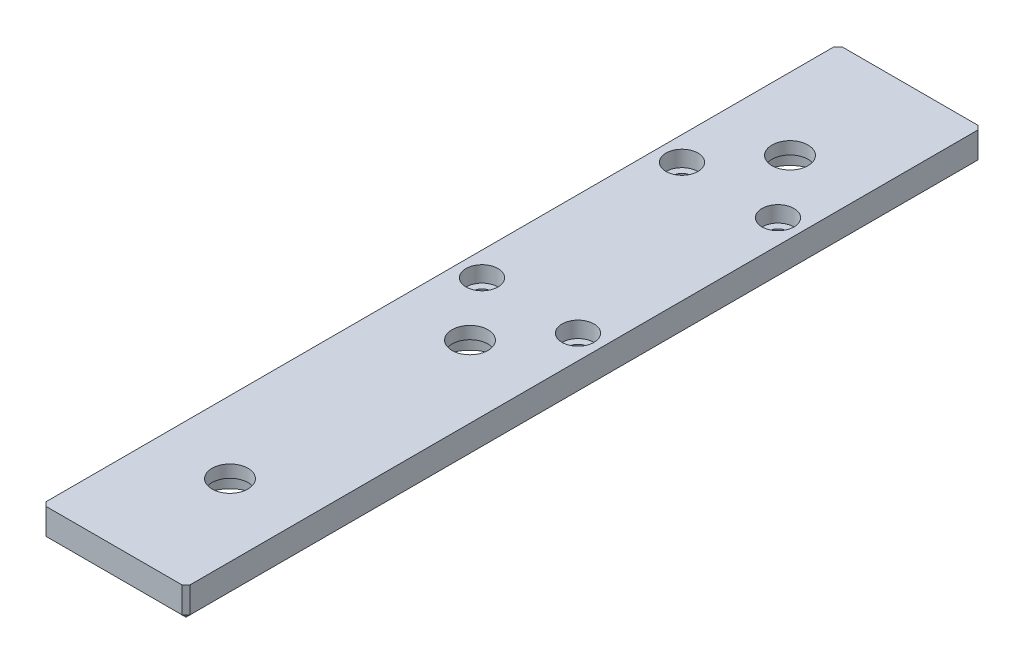
ISO-10303-21;
HEADER;
FILE_DESCRIPTION(('STEP AP214'),'2;1');
FILE_NAME('part.step','',(''),(''),'','','');
FILE_SCHEMA(('AUTOMOTIVE_DESIGN { 1 0 10303 214 1 1 1 1 }'));
ENDSEC;
DATA;
#1=APPLICATION_CONTEXT('core data for automotive mechanical design processes');
#2=APPLICATION_PROTOCOL_DEFINITION('international standard','automotive_design',2000,#1);
#3=PRODUCT_CONTEXT('',#1,'mechanical');
#4=PRODUCT('Part','Part','',(#3));
#5=PRODUCT_RELATED_PRODUCT_CATEGORY('part','',(#4));
#6=PRODUCT_DEFINITION_FORMATION('','',#4);
#7=PRODUCT_DEFINITION_CONTEXT('part definition',#1,'design');
#8=PRODUCT_DEFINITION('design','',#6,#7);
#9=PRODUCT_DEFINITION_SHAPE('','',#8);
#10=(LENGTH_UNIT() NAMED_UNIT(*) SI_UNIT(.MILLI.,.METRE.));
#11=(NAMED_UNIT(*) PLANE_ANGLE_UNIT() SI_UNIT($,.RADIAN.));
#12=(NAMED_UNIT(*) SI_UNIT($,.STERADIAN.) SOLID_ANGLE_UNIT());
#13=UNCERTAINTY_MEASURE_WITH_UNIT(LENGTH_MEASURE(1.E-05),#10,'distance_accuracy_value','');
#14=(GEOMETRIC_REPRESENTATION_CONTEXT(3) GLOBAL_UNCERTAINTY_ASSIGNED_CONTEXT((#13)) GLOBAL_UNIT_ASSIGNED_CONTEXT((#10,
#11,#12)) REPRESENTATION_CONTEXT('',''));
#15=CARTESIAN_POINT('',(0.,0.,0.));
#16=DIRECTION('',(0.,0.,1.));
#17=DIRECTION('',(1.,0.,0.));
#18=AXIS2_PLACEMENT_3D('',#15,#16,#17);
#19=CARTESIAN_POINT('',(18.,7.5,-99.5));
#20=DIRECTION('',(-1.,0.,0.));
#21=DIRECTION('',(0.,0.,1.));
#22=AXIS2_PLACEMENT_3D('',#19,#20,#21);
#23=PLANE('',#22);
#24=DIRECTION('',(0.,0.,-1.));
#25=VECTOR('',#24,1.);
#26=CARTESIAN_POINT('',(18.,1.,-99.5));
#27=LINE('',#26,#25);
#28=CARTESIAN_POINT('',(18.,1.,98.5));
#29=VERTEX_POINT('',#28);
#30=CARTESIAN_POINT('',(18.,1.,-98.5));
#31=VERTEX_POINT('',#30);
#32=EDGE_CURVE('E49',#29,#31,#27,.T.);
#33=ORIENTED_EDGE('',*,*,#32,.T.);
#34=DIRECTION('',(0.,1.,0.));
#35=VECTOR('',#34,1.);
#36=CARTESIAN_POINT('',(18.,7.5,-98.5));
#37=LINE('',#36,#35);
#38=CARTESIAN_POINT('',(18.,7.5,-98.5));
#39=VERTEX_POINT('',#38);
#40=EDGE_CURVE('E11',#31,#39,#37,.T.);
#41=ORIENTED_EDGE('',*,*,#40,.T.);
#42=DIRECTION('',(0.,0.,-1.));
#43=VECTOR('',#42,1.);
#44=CARTESIAN_POINT('',(18.,7.5,-99.5));
#45=LINE('',#44,#43);
#46=CARTESIAN_POINT('',(18.,7.5,98.5));
#47=VERTEX_POINT('',#46);
#48=EDGE_CURVE('E123',#47,#39,#45,.T.);
#49=ORIENTED_EDGE('',*,*,#48,.F.);
#50=DIRECTION('',(0.,-1.,0.));
#51=VECTOR('',#50,1.);
#52=CARTESIAN_POINT('',(18.,7.5,98.5));
#53=LINE('',#52,#51);
#54=EDGE_CURVE('E60',#47,#29,#53,.T.);
#55=ORIENTED_EDGE('',*,*,#54,.T.);
#56=EDGE_LOOP('',(#33,#41,#49,#55));
#57=FACE_BOUND('',#56,.T.);
#58=ADVANCED_FACE('F39',(#57),#23,.F.);
#59=CARTESIAN_POINT('',(-18.,7.5,-99.5));
#60=DIRECTION('',(0.,0.,1.));
#61=DIRECTION('',(1.,0.,0.));
#62=AXIS2_PLACEMENT_3D('',#59,#60,#61);
#63=PLANE('',#62);
#64=DIRECTION('',(-1.,0.,0.));
#65=VECTOR('',#64,1.);
#66=CARTESIAN_POINT('',(-18.,1.,-99.5));
#67=LINE('',#66,#65);
#68=CARTESIAN_POINT('',(17.,1.,-99.5));
#69=VERTEX_POINT('',#68);
#70=CARTESIAN_POINT('',(-17.,1.,-99.5));
#71=VERTEX_POINT('',#70);
#72=EDGE_CURVE('E142',#69,#71,#67,.T.);
#73=ORIENTED_EDGE('',*,*,#72,.T.);
#74=DIRECTION('',(0.,1.,0.));
#75=VECTOR('',#74,1.);
#76=CARTESIAN_POINT('',(-17.,7.5,-99.5));
#77=LINE('',#76,#75);
#78=CARTESIAN_POINT('',(-17.,7.5,-99.5));
#79=VERTEX_POINT('',#78);
#80=EDGE_CURVE('E135',#71,#79,#77,.T.);
#81=ORIENTED_EDGE('',*,*,#80,.T.);
#82=DIRECTION('',(-1.,0.,0.));
#83=VECTOR('',#82,1.);
#84=CARTESIAN_POINT('',(-18.,7.5,-99.5));
#85=LINE('',#84,#83);
#86=CARTESIAN_POINT('',(17.,7.5,-99.5));
#87=VERTEX_POINT('',#86);
#88=EDGE_CURVE('E121',#87,#79,#85,.T.);
#89=ORIENTED_EDGE('',*,*,#88,.F.);
#90=DIRECTION('',(0.,-1.,0.));
#91=VECTOR('',#90,1.);
#92=CARTESIAN_POINT('',(17.,7.5,-99.5));
#93=LINE('',#92,#91);
#94=EDGE_CURVE('E132',#87,#69,#93,.T.);
#95=ORIENTED_EDGE('',*,*,#94,.T.);
#96=EDGE_LOOP('',(#73,#81,#89,#95));
#97=FACE_BOUND('',#96,.T.);
#98=ADVANCED_FACE('F131',(#97),#63,.F.);
#99=CARTESIAN_POINT('',(-18.,7.5,-99.5));
#100=DIRECTION('',(1.,0.,0.));
#101=DIRECTION('',(0.,0.,-1.));
#102=AXIS2_PLACEMENT_3D('',#99,#100,#101);
#103=PLANE('',#102);
#104=DIRECTION('',(0.,0.,1.));
#105=VECTOR('',#104,1.);
#106=CARTESIAN_POINT('',(-18.,7.5,-99.5));
#107=LINE('',#106,#105);
#108=CARTESIAN_POINT('',(-18.,7.5,-98.5));
#109=VERTEX_POINT('',#108);
#110=CARTESIAN_POINT('',(-18.,7.5,98.5));
#111=VERTEX_POINT('',#110);
#112=EDGE_CURVE('E136',#109,#111,#107,.T.);
#113=ORIENTED_EDGE('',*,*,#112,.F.);
#114=DIRECTION('',(0.,-1.,0.));
#115=VECTOR('',#114,1.);
#116=CARTESIAN_POINT('',(-18.,7.5,-98.5));
#117=LINE('',#116,#115);
#118=CARTESIAN_POINT('',(-18.,1.,-98.5));
#119=VERTEX_POINT('',#118);
#120=EDGE_CURVE('E164',#109,#119,#117,.T.);
#121=ORIENTED_EDGE('',*,*,#120,.T.);
#122=DIRECTION('',(0.,0.,1.));
#123=VECTOR('',#122,1.);
#124=CARTESIAN_POINT('',(-18.,1.,-99.5));
#125=LINE('',#124,#123);
#126=CARTESIAN_POINT('',(-18.,1.,98.5));
#127=VERTEX_POINT('',#126);
#128=EDGE_CURVE('E162',#119,#127,#125,.T.);
#129=ORIENTED_EDGE('',*,*,#128,.T.);
#130=DIRECTION('',(0.,1.,0.));
#131=VECTOR('',#130,1.);
#132=CARTESIAN_POINT('',(-18.,7.5,98.5));
#133=LINE('',#132,#131);
#134=EDGE_CURVE('E160',#127,#111,#133,.T.);
#135=ORIENTED_EDGE('',*,*,#134,.T.);
#136=EDGE_LOOP('',(#113,#121,#129,#135));
#137=FACE_BOUND('',#136,.T.);
#138=ADVANCED_FACE('F310',(#137),#103,.F.);
#139=CARTESIAN_POINT('',(-18.,7.5,99.5));
#140=DIRECTION('',(0.,0.,-1.));
#141=DIRECTION('',(-1.,0.,0.));
#142=AXIS2_PLACEMENT_3D('',#139,#140,#141);
#143=PLANE('',#142);
#144=DIRECTION('',(1.,0.,0.));
#145=VECTOR('',#144,1.);
#146=CARTESIAN_POINT('',(-18.,7.5,99.5));
#147=LINE('',#146,#145);
#148=CARTESIAN_POINT('',(-17.,7.5,99.5));
#149=VERTEX_POINT('',#148);
#150=CARTESIAN_POINT('',(17.,7.5,99.5));
#151=VERTEX_POINT('',#150);
#152=EDGE_CURVE('E143',#149,#151,#147,.T.);
#153=ORIENTED_EDGE('',*,*,#152,.F.);
#154=DIRECTION('',(0.,-1.,0.));
#155=VECTOR('',#154,1.);
#156=CARTESIAN_POINT('',(-17.,7.5,99.5));
#157=LINE('',#156,#155);
#158=CARTESIAN_POINT('',(-17.,1.,99.5));
#159=VERTEX_POINT('',#158);
#160=EDGE_CURVE('E174',#149,#159,#157,.T.);
#161=ORIENTED_EDGE('',*,*,#160,.T.);
#162=DIRECTION('',(1.,0.,0.));
#163=VECTOR('',#162,1.);
#164=CARTESIAN_POINT('',(-18.,1.,99.5));
#165=LINE('',#164,#163);
#166=CARTESIAN_POINT('',(17.,1.,99.5));
#167=VERTEX_POINT('',#166);
#168=EDGE_CURVE('E172',#159,#167,#165,.T.);
#169=ORIENTED_EDGE('',*,*,#168,.T.);
#170=DIRECTION('',(0.,1.,0.));
#171=VECTOR('',#170,1.);
#172=CARTESIAN_POINT('',(17.,7.5,99.5));
#173=LINE('',#172,#171);
#174=EDGE_CURVE('E170',#167,#151,#173,.T.);
#175=ORIENTED_EDGE('',*,*,#174,.T.);
#176=EDGE_LOOP('',(#153,#161,#169,#175));
#177=FACE_BOUND('',#176,.T.);
#178=ADVANCED_FACE('F276',(#177),#143,.F.);
#179=CARTESIAN_POINT('',(0.,7.5,0.));
#180=DIRECTION('',(0.,1.,0.));
#181=DIRECTION('',(0.,0.,1.));
#182=AXIS2_PLACEMENT_3D('',#179,#180,#181);
#183=PLANE('',#182);
#184=CARTESIAN_POINT('',(0.,7.5,-69.5));
#185=DIRECTION('',(0.,-1.,0.));
#186=DIRECTION('',(0.,0.,-1.));
#187=AXIS2_PLACEMENT_3D('',#184,#185,#186);
#188=CIRCLE('',#187,4.5);
#189=CARTESIAN_POINT('',(0.,7.5,-74.));
#190=VERTEX_POINT('',#189);
#191=EDGE_CURVE('E711',#190,#190,#188,.T.);
#192=ORIENTED_EDGE('',*,*,#191,.T.);
#193=EDGE_LOOP('',(#192));
#194=FACE_BOUND('',#193,.T.);
#195=CARTESIAN_POINT('',(0.,7.5,10.5));
#196=DIRECTION('',(0.,-1.,0.));
#197=DIRECTION('',(0.,0.,-1.));
#198=AXIS2_PLACEMENT_3D('',#195,#196,#197);
#199=CIRCLE('',#198,4.5);
#200=CARTESIAN_POINT('',(0.,7.5,6.00000000000002));
#201=VERTEX_POINT('',#200);
#202=EDGE_CURVE('E723',#201,#201,#199,.T.);
#203=ORIENTED_EDGE('',*,*,#202,.T.);
#204=EDGE_LOOP('',(#203));
#205=FACE_BOUND('',#204,.T.);
#206=CARTESIAN_POINT('',(0.,7.5,70.5));
#207=DIRECTION('',(0.,-1.,0.));
#208=DIRECTION('',(0.,0.,-1.));
#209=AXIS2_PLACEMENT_3D('',#206,#207,#208);
#210=CIRCLE('',#209,4.5);
#211=CARTESIAN_POINT('',(0.,7.5,66.));
#212=VERTEX_POINT('',#211);
#213=EDGE_CURVE('E181',#212,#212,#210,.T.);
#214=ORIENTED_EDGE('',*,*,#213,.T.);
#215=EDGE_LOOP('',(#214));
#216=FACE_BOUND('',#215,.T.);
#217=CARTESIAN_POINT('',(-12.,7.5,-54.5));
#218=DIRECTION('',(0.,1.,0.));
#219=DIRECTION('',(0.,0.,1.));
#220=AXIS2_PLACEMENT_3D('',#217,#218,#219);
#221=CIRCLE('',#220,4.);
#222=CARTESIAN_POINT('',(-12.,7.5,-50.5));
#223=VERTEX_POINT('',#222);
#224=EDGE_CURVE('E209',#223,#223,#221,.T.);
#225=ORIENTED_EDGE('',*,*,#224,.F.);
#226=EDGE_LOOP('',(#225));
#227=FACE_BOUND('',#226,.T.);
#228=CARTESIAN_POINT('',(12.,7.5,-54.5));
#229=DIRECTION('',(0.,1.,0.));
#230=DIRECTION('',(0.,0.,1.));
#231=AXIS2_PLACEMENT_3D('',#228,#229,#230);
#232=CIRCLE('',#231,4.);
#233=CARTESIAN_POINT('',(12.,7.5,-50.5));
#234=VERTEX_POINT('',#233);
#235=EDGE_CURVE('E227',#234,#234,#232,.T.);
#236=ORIENTED_EDGE('',*,*,#235,.F.);
#237=EDGE_LOOP('',(#236));
#238=FACE_BOUND('',#237,.T.);
#239=CARTESIAN_POINT('',(12.,7.5,-4.49999999999998));
#240=DIRECTION('',(0.,1.,0.));
#241=DIRECTION('',(0.,0.,1.));
#242=AXIS2_PLACEMENT_3D('',#239,#240,#241);
#243=CIRCLE('',#242,4.);
#244=CARTESIAN_POINT('',(12.,7.5,-0.499999999999983));
#245=VERTEX_POINT('',#244);
#246=EDGE_CURVE('E239',#245,#245,#243,.T.);
#247=ORIENTED_EDGE('',*,*,#246,.F.);
#248=EDGE_LOOP('',(#247));
#249=FACE_BOUND('',#248,.T.);
#250=CARTESIAN_POINT('',(-12.,7.5,-4.49999999999998));
#251=DIRECTION('',(0.,1.,0.));
#252=DIRECTION('',(0.,0.,1.));
#253=AXIS2_PLACEMENT_3D('',#250,#251,#252);
#254=CIRCLE('',#253,4.);
#255=CARTESIAN_POINT('',(-12.,7.5,-0.499999999999983));
#256=VERTEX_POINT('',#255);
#257=EDGE_CURVE('E251',#256,#256,#254,.T.);
#258=ORIENTED_EDGE('',*,*,#257,.F.);
#259=EDGE_LOOP('',(#258));
#260=FACE_BOUND('',#259,.T.);
#261=ORIENTED_EDGE('',*,*,#88,.T.);
#262=DIRECTION('',(0.707106781186548,0.,-0.707106781186548));
#263=VECTOR('',#262,1.);
#264=CARTESIAN_POINT('',(-58.25,7.5,-58.25));
#265=LINE('',#264,#263);
#266=EDGE_CURVE('E168',#79,#109,#265,.F.);
#267=ORIENTED_EDGE('',*,*,#266,.T.);
#268=ORIENTED_EDGE('',*,*,#112,.T.);
#269=DIRECTION('',(-0.707106781186548,0.,-0.707106781186548));
#270=VECTOR('',#269,1.);
#271=CARTESIAN_POINT('',(-58.25,7.5,58.25));
#272=LINE('',#271,#270);
#273=EDGE_CURVE('E126',#111,#149,#272,.F.);
#274=ORIENTED_EDGE('',*,*,#273,.T.);
#275=ORIENTED_EDGE('',*,*,#152,.T.);
#276=DIRECTION('',(-0.707106781186546,0.,0.707106781186549));
#277=VECTOR('',#276,1.);
#278=CARTESIAN_POINT('',(58.2500000000001,7.5,58.2499999999998));
#279=LINE('',#278,#277);
#280=EDGE_CURVE('E127',#151,#47,#279,.F.);
#281=ORIENTED_EDGE('',*,*,#280,.T.);
#282=ORIENTED_EDGE('',*,*,#48,.T.);
#283=DIRECTION('',(0.707106781186548,0.,0.707106781186548));
#284=VECTOR('',#283,1.);
#285=CARTESIAN_POINT('',(58.25,7.5,-58.25));
#286=LINE('',#285,#284);
#287=EDGE_CURVE('E118',#39,#87,#286,.F.);
#288=ORIENTED_EDGE('',*,*,#287,.T.);
#289=EDGE_LOOP('',(#261,#267,#268,#274,#275,#281,#282,#288));
#290=FACE_BOUND('',#289,.T.);
#291=ADVANCED_FACE('F120',(#194,#205,#216,#227,#238,#249,#260,#290),#183,.T.);
#292=CARTESIAN_POINT('',(0.,0.,0.));
#293=DIRECTION('',(0.,1.,0.));
#294=DIRECTION('',(0.,0.,1.));
#295=AXIS2_PLACEMENT_3D('',#292,#293,#294);
#296=PLANE('',#295);
#297=CARTESIAN_POINT('',(0.,0.,-69.5));
#298=DIRECTION('',(0.,-1.,0.));
#299=DIRECTION('',(0.,0.,-1.));
#300=AXIS2_PLACEMENT_3D('',#297,#298,#299);
#301=CIRCLE('',#300,7.5);
#302=CARTESIAN_POINT('',(0.,0.,-77.));
#303=VERTEX_POINT('',#302);
#304=EDGE_CURVE('E704',#303,#303,#301,.T.);
#305=ORIENTED_EDGE('',*,*,#304,.F.);
#306=EDGE_LOOP('',(#305));
#307=FACE_BOUND('',#306,.T.);
#308=CARTESIAN_POINT('',(0.,0.,10.5));
#309=DIRECTION('',(0.,-1.,0.));
#310=DIRECTION('',(0.,0.,-1.));
#311=AXIS2_PLACEMENT_3D('',#308,#309,#310);
#312=CIRCLE('',#311,7.5);
#313=CARTESIAN_POINT('',(0.,0.,3.00000000000001));
#314=VERTEX_POINT('',#313);
#315=EDGE_CURVE('E714',#314,#314,#312,.T.);
#316=ORIENTED_EDGE('',*,*,#315,.F.);
#317=EDGE_LOOP('',(#316));
#318=FACE_BOUND('',#317,.T.);
#319=CARTESIAN_POINT('',(0.,0.,70.5));
#320=DIRECTION('',(0.,-1.,0.));
#321=DIRECTION('',(0.,0.,-1.));
#322=AXIS2_PLACEMENT_3D('',#319,#320,#321);
#323=CIRCLE('',#322,7.5);
#324=CARTESIAN_POINT('',(0.,0.,63.));
#325=VERTEX_POINT('',#324);
#326=EDGE_CURVE('E726',#325,#325,#323,.T.);
#327=ORIENTED_EDGE('',*,*,#326,.F.);
#328=EDGE_LOOP('',(#327));
#329=FACE_BOUND('',#328,.T.);
#330=DIRECTION('',(0.,0.,-1.));
#331=VECTOR('',#330,1.);
#332=CARTESIAN_POINT('',(-17.,0.,0.));
#333=LINE('',#332,#331);
#334=CARTESIAN_POINT('',(-17.,0.,98.5));
#335=VERTEX_POINT('',#334);
#336=CARTESIAN_POINT('',(-17.,0.,-98.5));
#337=VERTEX_POINT('',#336);
#338=EDGE_CURVE('E155',#335,#337,#333,.T.);
#339=ORIENTED_EDGE('',*,*,#338,.T.);
#340=DIRECTION('',(1.,0.,0.));
#341=VECTOR('',#340,1.);
#342=CARTESIAN_POINT('',(0.,0.,-98.5));
#343=LINE('',#342,#341);
#344=CARTESIAN_POINT('',(17.,0.,-98.5));
#345=VERTEX_POINT('',#344);
#346=EDGE_CURVE('E157',#337,#345,#343,.T.);
#347=ORIENTED_EDGE('',*,*,#346,.T.);
#348=DIRECTION('',(0.,0.,1.));
#349=VECTOR('',#348,1.);
#350=CARTESIAN_POINT('',(17.,0.,0.));
#351=LINE('',#350,#349);
#352=CARTESIAN_POINT('',(17.,0.,98.5));
#353=VERTEX_POINT('',#352);
#354=EDGE_CURVE('E151',#345,#353,#351,.T.);
#355=ORIENTED_EDGE('',*,*,#354,.T.);
#356=DIRECTION('',(-1.,0.,0.));
#357=VECTOR('',#356,1.);
#358=CARTESIAN_POINT('',(0.,0.,98.5));
#359=LINE('',#358,#357);
#360=EDGE_CURVE('E153',#353,#335,#359,.T.);
#361=ORIENTED_EDGE('',*,*,#360,.T.);
#362=EDGE_LOOP('',(#339,#347,#355,#361));
#363=FACE_BOUND('',#362,.T.);
#364=CARTESIAN_POINT('',(-12.,0.,-54.5));
#365=DIRECTION('',(0.,1.,0.));
#366=DIRECTION('',(0.,0.,1.));
#367=AXIS2_PLACEMENT_3D('',#364,#365,#366);
#368=CIRCLE('',#367,2.25);
#369=CARTESIAN_POINT('',(-12.,0.,-52.25));
#370=VERTEX_POINT('',#369);
#371=EDGE_CURVE('E224',#370,#370,#368,.T.);
#372=ORIENTED_EDGE('',*,*,#371,.T.);
#373=EDGE_LOOP('',(#372));
#374=FACE_BOUND('',#373,.T.);
#375=CARTESIAN_POINT('',(12.,0.,-54.5));
#376=DIRECTION('',(0.,1.,0.));
#377=DIRECTION('',(0.,0.,1.));
#378=AXIS2_PLACEMENT_3D('',#375,#376,#377);
#379=CIRCLE('',#378,2.25);
#380=CARTESIAN_POINT('',(12.,0.,-52.25));
#381=VERTEX_POINT('',#380);
#382=EDGE_CURVE('E236',#381,#381,#379,.T.);
#383=ORIENTED_EDGE('',*,*,#382,.T.);
#384=EDGE_LOOP('',(#383));
#385=FACE_BOUND('',#384,.T.);
#386=CARTESIAN_POINT('',(12.,0.,-4.49999999999998));
#387=DIRECTION('',(0.,1.,0.));
#388=DIRECTION('',(0.,0.,1.));
#389=AXIS2_PLACEMENT_3D('',#386,#387,#388);
#390=CIRCLE('',#389,2.25);
#391=CARTESIAN_POINT('',(12.,0.,-2.24999999999998));
#392=VERTEX_POINT('',#391);
#393=EDGE_CURVE('E248',#392,#392,#390,.T.);
#394=ORIENTED_EDGE('',*,*,#393,.T.);
#395=EDGE_LOOP('',(#394));
#396=FACE_BOUND('',#395,.T.);
#397=CARTESIAN_POINT('',(-12.,0.,-4.49999999999998));
#398=DIRECTION('',(0.,1.,0.));
#399=DIRECTION('',(0.,0.,1.));
#400=AXIS2_PLACEMENT_3D('',#397,#398,#399);
#401=CIRCLE('',#400,2.25);
#402=CARTESIAN_POINT('',(-12.,0.,-2.24999999999998));
#403=VERTEX_POINT('',#402);
#404=EDGE_CURVE('E260',#403,#403,#401,.T.);
#405=ORIENTED_EDGE('',*,*,#404,.T.);
#406=EDGE_LOOP('',(#405));
#407=FACE_BOUND('',#406,.T.);
#408=ADVANCED_FACE('F284',(#307,#318,#329,#363,#374,#385,#396,#407),#296,.F.);
#409=CARTESIAN_POINT('',(-12.,7.5,-4.49999999999998));
#410=DIRECTION('',(0.,1.,0.));
#411=DIRECTION('',(0.,0.,1.));
#412=AXIS2_PLACEMENT_3D('',#409,#410,#411);
#413=CYLINDRICAL_SURFACE('',#412,2.25);
#414=ORIENTED_EDGE('',*,*,#404,.F.);
#415=EDGE_LOOP('',(#414));
#416=FACE_BOUND('',#415,.T.);
#417=CARTESIAN_POINT('',(-12.,3.5,-4.49999999999998));
#418=DIRECTION('',(0.,1.,0.));
#419=DIRECTION('',(0.,0.,1.));
#420=AXIS2_PLACEMENT_3D('',#417,#418,#419);
#421=CIRCLE('',#420,2.25);
#422=CARTESIAN_POINT('',(-12.,3.5,-2.24999999999998));
#423=VERTEX_POINT('',#422);
#424=EDGE_CURVE('E257',#423,#423,#421,.T.);
#425=ORIENTED_EDGE('',*,*,#424,.T.);
#426=EDGE_LOOP('',(#425));
#427=FACE_BOUND('',#426,.T.);
#428=ADVANCED_FACE('F429',(#416,#427),#413,.F.);
#429=CARTESIAN_POINT('',(-9.75,3.5,-4.49999999999998));
#430=DIRECTION('',(0.,-1.,0.));
#431=DIRECTION('',(0.,0.,-1.));
#432=AXIS2_PLACEMENT_3D('',#429,#430,#431);
#433=PLANE('',#432);
#434=ORIENTED_EDGE('',*,*,#424,.F.);
#435=EDGE_LOOP('',(#434));
#436=FACE_BOUND('',#435,.T.);
#437=CARTESIAN_POINT('',(-12.,3.5,-4.49999999999998));
#438=DIRECTION('',(0.,1.,0.));
#439=DIRECTION('',(0.,0.,1.));
#440=AXIS2_PLACEMENT_3D('',#437,#438,#439);
#441=CIRCLE('',#440,4.);
#442=CARTESIAN_POINT('',(-12.,3.5,-0.499999999999983));
#443=VERTEX_POINT('',#442);
#444=EDGE_CURVE('E254',#443,#443,#441,.T.);
#445=ORIENTED_EDGE('',*,*,#444,.T.);
#446=EDGE_LOOP('',(#445));
#447=FACE_BOUND('',#446,.T.);
#448=ADVANCED_FACE('F425',(#436,#447),#433,.F.);
#449=CARTESIAN_POINT('',(-12.,7.5,-4.49999999999998));
#450=DIRECTION('',(0.,1.,0.));
#451=DIRECTION('',(0.,0.,1.));
#452=AXIS2_PLACEMENT_3D('',#449,#450,#451);
#453=CYLINDRICAL_SURFACE('',#452,4.);
#454=ORIENTED_EDGE('',*,*,#444,.F.);
#455=EDGE_LOOP('',(#454));
#456=FACE_BOUND('',#455,.T.);
#457=ORIENTED_EDGE('',*,*,#257,.T.);
#458=EDGE_LOOP('',(#457));
#459=FACE_BOUND('',#458,.T.);
#460=ADVANCED_FACE('F421',(#456,#459),#453,.F.);
#461=CARTESIAN_POINT('',(12.,7.5,-4.49999999999998));
#462=DIRECTION('',(0.,1.,0.));
#463=DIRECTION('',(0.,0.,1.));
#464=AXIS2_PLACEMENT_3D('',#461,#462,#463);
#465=CYLINDRICAL_SURFACE('',#464,2.25);
#466=ORIENTED_EDGE('',*,*,#393,.F.);
#467=EDGE_LOOP('',(#466));
#468=FACE_BOUND('',#467,.T.);
#469=CARTESIAN_POINT('',(12.,3.5,-4.49999999999998));
#470=DIRECTION('',(0.,1.,0.));
#471=DIRECTION('',(0.,0.,1.));
#472=AXIS2_PLACEMENT_3D('',#469,#470,#471);
#473=CIRCLE('',#472,2.25);
#474=CARTESIAN_POINT('',(12.,3.5,-2.24999999999998));
#475=VERTEX_POINT('',#474);
#476=EDGE_CURVE('E245',#475,#475,#473,.T.);
#477=ORIENTED_EDGE('',*,*,#476,.T.);
#478=EDGE_LOOP('',(#477));
#479=FACE_BOUND('',#478,.T.);
#480=ADVANCED_FACE('F417',(#468,#479),#465,.F.);
#481=CARTESIAN_POINT('',(14.25,3.5,-4.49999999999998));
#482=DIRECTION('',(0.,-1.,0.));
#483=DIRECTION('',(0.,0.,-1.));
#484=AXIS2_PLACEMENT_3D('',#481,#482,#483);
#485=PLANE('',#484);
#486=ORIENTED_EDGE('',*,*,#476,.F.);
#487=EDGE_LOOP('',(#486));
#488=FACE_BOUND('',#487,.T.);
#489=CARTESIAN_POINT('',(12.,3.5,-4.49999999999998));
#490=DIRECTION('',(0.,1.,0.));
#491=DIRECTION('',(0.,0.,1.));
#492=AXIS2_PLACEMENT_3D('',#489,#490,#491);
#493=CIRCLE('',#492,4.);
#494=CARTESIAN_POINT('',(12.,3.5,-0.499999999999983));
#495=VERTEX_POINT('',#494);
#496=EDGE_CURVE('E242',#495,#495,#493,.T.);
#497=ORIENTED_EDGE('',*,*,#496,.T.);
#498=EDGE_LOOP('',(#497));
#499=FACE_BOUND('',#498,.T.);
#500=ADVANCED_FACE('F413',(#488,#499),#485,.F.);
#501=CARTESIAN_POINT('',(12.,7.5,-4.49999999999998));
#502=DIRECTION('',(0.,1.,0.));
#503=DIRECTION('',(0.,0.,1.));
#504=AXIS2_PLACEMENT_3D('',#501,#502,#503);
#505=CYLINDRICAL_SURFACE('',#504,4.);
#506=ORIENTED_EDGE('',*,*,#496,.F.);
#507=EDGE_LOOP('',(#506));
#508=FACE_BOUND('',#507,.T.);
#509=ORIENTED_EDGE('',*,*,#246,.T.);
#510=EDGE_LOOP('',(#509));
#511=FACE_BOUND('',#510,.T.);
#512=ADVANCED_FACE('F409',(#508,#511),#505,.F.);
#513=CARTESIAN_POINT('',(12.,7.5,-54.5));
#514=DIRECTION('',(0.,1.,0.));
#515=DIRECTION('',(0.,0.,1.));
#516=AXIS2_PLACEMENT_3D('',#513,#514,#515);
#517=CYLINDRICAL_SURFACE('',#516,2.25);
#518=ORIENTED_EDGE('',*,*,#382,.F.);
#519=EDGE_LOOP('',(#518));
#520=FACE_BOUND('',#519,.T.);
#521=CARTESIAN_POINT('',(12.,3.5,-54.5));
#522=DIRECTION('',(0.,1.,0.));
#523=DIRECTION('',(0.,0.,1.));
#524=AXIS2_PLACEMENT_3D('',#521,#522,#523);
#525=CIRCLE('',#524,2.25);
#526=CARTESIAN_POINT('',(12.,3.5,-52.25));
#527=VERTEX_POINT('',#526);
#528=EDGE_CURVE('E233',#527,#527,#525,.T.);
#529=ORIENTED_EDGE('',*,*,#528,.T.);
#530=EDGE_LOOP('',(#529));
#531=FACE_BOUND('',#530,.T.);
#532=ADVANCED_FACE('F405',(#520,#531),#517,.F.);
#533=CARTESIAN_POINT('',(14.25,3.5,-54.5));
#534=DIRECTION('',(0.,-1.,0.));
#535=DIRECTION('',(0.,0.,-1.));
#536=AXIS2_PLACEMENT_3D('',#533,#534,#535);
#537=PLANE('',#536);
#538=ORIENTED_EDGE('',*,*,#528,.F.);
#539=EDGE_LOOP('',(#538));
#540=FACE_BOUND('',#539,.T.);
#541=CARTESIAN_POINT('',(12.,3.5,-54.5));
#542=DIRECTION('',(0.,1.,0.));
#543=DIRECTION('',(0.,0.,1.));
#544=AXIS2_PLACEMENT_3D('',#541,#542,#543);
#545=CIRCLE('',#544,4.);
#546=CARTESIAN_POINT('',(12.,3.5,-50.5));
#547=VERTEX_POINT('',#546);
#548=EDGE_CURVE('E230',#547,#547,#545,.T.);
#549=ORIENTED_EDGE('',*,*,#548,.T.);
#550=EDGE_LOOP('',(#549));
#551=FACE_BOUND('',#550,.T.);
#552=ADVANCED_FACE('F401',(#540,#551),#537,.F.);
#553=CARTESIAN_POINT('',(12.,7.5,-54.5));
#554=DIRECTION('',(0.,1.,0.));
#555=DIRECTION('',(0.,0.,1.));
#556=AXIS2_PLACEMENT_3D('',#553,#554,#555);
#557=CYLINDRICAL_SURFACE('',#556,4.);
#558=ORIENTED_EDGE('',*,*,#548,.F.);
#559=EDGE_LOOP('',(#558));
#560=FACE_BOUND('',#559,.T.);
#561=ORIENTED_EDGE('',*,*,#235,.T.);
#562=EDGE_LOOP('',(#561));
#563=FACE_BOUND('',#562,.T.);
#564=ADVANCED_FACE('F397',(#560,#563),#557,.F.);
#565=CARTESIAN_POINT('',(-12.,7.5,-54.5));
#566=DIRECTION('',(0.,1.,0.));
#567=DIRECTION('',(0.,0.,1.));
#568=AXIS2_PLACEMENT_3D('',#565,#566,#567);
#569=CYLINDRICAL_SURFACE('',#568,2.25);
#570=ORIENTED_EDGE('',*,*,#371,.F.);
#571=EDGE_LOOP('',(#570));
#572=FACE_BOUND('',#571,.T.);
#573=CARTESIAN_POINT('',(-12.,3.5,-54.5));
#574=DIRECTION('',(0.,1.,0.));
#575=DIRECTION('',(0.,0.,1.));
#576=AXIS2_PLACEMENT_3D('',#573,#574,#575);
#577=CIRCLE('',#576,2.25);
#578=CARTESIAN_POINT('',(-12.,3.5,-52.25));
#579=VERTEX_POINT('',#578);
#580=EDGE_CURVE('E217',#579,#579,#577,.T.);
#581=ORIENTED_EDGE('',*,*,#580,.T.);
#582=EDGE_LOOP('',(#581));
#583=FACE_BOUND('',#582,.T.);
#584=ADVANCED_FACE('F388',(#572,#583),#569,.F.);
#585=CARTESIAN_POINT('',(-9.75,3.5,-54.5));
#586=DIRECTION('',(0.,-1.,0.));
#587=DIRECTION('',(0.,0.,-1.));
#588=AXIS2_PLACEMENT_3D('',#585,#586,#587);
#589=PLANE('',#588);
#590=ORIENTED_EDGE('',*,*,#580,.F.);
#591=EDGE_LOOP('',(#590));
#592=FACE_BOUND('',#591,.T.);
#593=CARTESIAN_POINT('',(-12.,3.5,-54.5));
#594=DIRECTION('',(0.,1.,0.));
#595=DIRECTION('',(0.,0.,1.));
#596=AXIS2_PLACEMENT_3D('',#593,#594,#595);
#597=CIRCLE('',#596,4.);
#598=CARTESIAN_POINT('',(-12.,3.5,-50.5));
#599=VERTEX_POINT('',#598);
#600=EDGE_CURVE('E212',#599,#599,#597,.T.);
#601=ORIENTED_EDGE('',*,*,#600,.T.);
#602=EDGE_LOOP('',(#601));
#603=FACE_BOUND('',#602,.T.);
#604=ADVANCED_FACE('F381',(#592,#603),#589,.F.);
#605=CARTESIAN_POINT('',(-12.,7.5,-54.5));
#606=DIRECTION('',(0.,1.,0.));
#607=DIRECTION('',(0.,0.,1.));
#608=AXIS2_PLACEMENT_3D('',#605,#606,#607);
#609=CYLINDRICAL_SURFACE('',#608,4.);
#610=ORIENTED_EDGE('',*,*,#600,.F.);
#611=EDGE_LOOP('',(#610));
#612=FACE_BOUND('',#611,.T.);
#613=ORIENTED_EDGE('',*,*,#224,.T.);
#614=EDGE_LOOP('',(#613));
#615=FACE_BOUND('',#614,.T.);
#616=ADVANCED_FACE('F376',(#612,#615),#609,.F.);
#617=CARTESIAN_POINT('',(18.,7.5,98.5));
#618=DIRECTION('',(-0.707106781186549,0.,-0.707106781186546));
#619=DIRECTION('',(0.,-1.,0.));
#620=AXIS2_PLACEMENT_3D('',#617,#618,#619);
#621=PLANE('',#620);
#622=ORIENTED_EDGE('',*,*,#280,.F.);
#623=ORIENTED_EDGE('',*,*,#174,.F.);
#624=DIRECTION('',(0.707106781186546,0.,-0.707106781186549));
#625=VECTOR('',#624,1.);
#626=CARTESIAN_POINT('',(17.,1.,99.5));
#627=LINE('',#626,#625);
#628=EDGE_CURVE('E204',#29,#167,#627,.F.);
#629=ORIENTED_EDGE('',*,*,#628,.F.);
#630=ORIENTED_EDGE('',*,*,#54,.F.);
#631=EDGE_LOOP('',(#622,#623,#629,#630));
#632=FACE_BOUND('',#631,.T.);
#633=ADVANCED_FACE('F42',(#632),#621,.F.);
#634=CARTESIAN_POINT('',(-17.,7.5,99.5));
#635=DIRECTION('',(0.707106781186547,0.,-0.707106781186547));
#636=DIRECTION('',(0.,-1.,0.));
#637=AXIS2_PLACEMENT_3D('',#634,#635,#636);
#638=PLANE('',#637);
#639=ORIENTED_EDGE('',*,*,#273,.F.);
#640=ORIENTED_EDGE('',*,*,#134,.F.);
#641=DIRECTION('',(0.707106781186547,0.,0.707106781186547));
#642=VECTOR('',#641,1.);
#643=CARTESIAN_POINT('',(-18.,1.,98.5));
#644=LINE('',#643,#642);
#645=EDGE_CURVE('E202',#159,#127,#644,.F.);
#646=ORIENTED_EDGE('',*,*,#645,.F.);
#647=ORIENTED_EDGE('',*,*,#160,.F.);
#648=EDGE_LOOP('',(#639,#640,#646,#647));
#649=FACE_BOUND('',#648,.T.);
#650=ADVANCED_FACE('F272',(#649),#638,.F.);
#651=CARTESIAN_POINT('',(-18.,1.,99.5));
#652=DIRECTION('',(0.,0.707106781186547,-0.707106781186547));
#653=DIRECTION('',(1.,0.,0.));
#654=AXIS2_PLACEMENT_3D('',#651,#652,#653);
#655=PLANE('',#654);
#656=DIRECTION('',(0.,0.707106781186547,0.707106781186547));
#657=VECTOR('',#656,1.);
#658=CARTESIAN_POINT('',(17.,1.,99.5));
#659=LINE('',#658,#657);
#660=EDGE_CURVE('E44',#167,#353,#659,.F.);
#661=ORIENTED_EDGE('',*,*,#660,.F.);
#662=ORIENTED_EDGE('',*,*,#168,.F.);
#663=DIRECTION('',(0.,-0.707106781186547,-0.707106781186547));
#664=VECTOR('',#663,1.);
#665=CARTESIAN_POINT('',(-17.,0.5,99.));
#666=LINE('',#665,#664);
#667=EDGE_CURVE('E199',#335,#159,#666,.F.);
#668=ORIENTED_EDGE('',*,*,#667,.F.);
#669=ORIENTED_EDGE('',*,*,#360,.F.);
#670=EDGE_LOOP('',(#661,#662,#668,#669));
#671=FACE_BOUND('',#670,.T.);
#672=ADVANCED_FACE('F280',(#671),#655,.F.);
#673=CARTESIAN_POINT('',(17.,1.,99.5));
#674=DIRECTION('',(0.577350269189627,-0.577350269189626,0.577350269189625));
#675=DIRECTION('',(0.707106781186547,0.707106781186548,0.));
#676=AXIS2_PLACEMENT_3D('',#673,#674,#675);
#677=PLANE('',#676);
#678=ORIENTED_EDGE('',*,*,#628,.T.);
#679=ORIENTED_EDGE('',*,*,#660,.T.);
#680=DIRECTION('',(-0.707106781186547,-0.707106781186547,0.));
#681=VECTOR('',#680,1.);
#682=CARTESIAN_POINT('',(17.5,0.500000000000002,98.5));
#683=LINE('',#682,#681);
#684=EDGE_CURVE('E196',#29,#353,#683,.T.);
#685=ORIENTED_EDGE('',*,*,#684,.F.);
#686=EDGE_LOOP('',(#678,#679,#685));
#687=FACE_BOUND('',#686,.T.);
#688=ADVANCED_FACE('F293',(#687),#677,.T.);
#689=CARTESIAN_POINT('',(-18.,1.,98.5));
#690=DIRECTION('',(-0.577350269189626,-0.577350269189626,0.577350269189626));
#691=DIRECTION('',(0.707106781186547,0.,0.707106781186547));
#692=AXIS2_PLACEMENT_3D('',#689,#690,#691);
#693=PLANE('',#692);
#694=ORIENTED_EDGE('',*,*,#667,.T.);
#695=ORIENTED_EDGE('',*,*,#645,.T.);
#696=DIRECTION('',(-0.707106781186547,0.707106781186548,0.));
#697=VECTOR('',#696,1.);
#698=CARTESIAN_POINT('',(-18.,1.,98.5));
#699=LINE('',#698,#697);
#700=EDGE_CURVE('E193',#335,#127,#699,.T.);
#701=ORIENTED_EDGE('',*,*,#700,.F.);
#702=EDGE_LOOP('',(#694,#695,#701));
#703=FACE_BOUND('',#702,.T.);
#704=ADVANCED_FACE('F295',(#703),#693,.T.);
#705=CARTESIAN_POINT('',(18.,1.,-99.5));
#706=DIRECTION('',(-0.707106781186547,0.707106781186547,0.));
#707=DIRECTION('',(0.,0.,-1.));
#708=AXIS2_PLACEMENT_3D('',#705,#706,#707);
#709=PLANE('',#708);
#710=ORIENTED_EDGE('',*,*,#684,.T.);
#711=ORIENTED_EDGE('',*,*,#354,.F.);
#712=DIRECTION('',(0.707106781186547,0.707106781186547,0.));
#713=VECTOR('',#712,1.);
#714=CARTESIAN_POINT('',(17.,0.,-98.5));
#715=LINE('',#714,#713);
#716=EDGE_CURVE('E190',#31,#345,#715,.F.);
#717=ORIENTED_EDGE('',*,*,#716,.F.);
#718=ORIENTED_EDGE('',*,*,#32,.F.);
#719=EDGE_LOOP('',(#710,#711,#717,#718));
#720=FACE_BOUND('',#719,.T.);
#721=ADVANCED_FACE('F292',(#720),#709,.F.);
#722=CARTESIAN_POINT('',(17.,7.5,-99.5));
#723=DIRECTION('',(-0.707106781186547,0.,0.707106781186547));
#724=DIRECTION('',(0.,-1.,0.));
#725=AXIS2_PLACEMENT_3D('',#722,#723,#724);
#726=PLANE('',#725);
#727=ORIENTED_EDGE('',*,*,#287,.F.);
#728=ORIENTED_EDGE('',*,*,#40,.F.);
#729=DIRECTION('',(-0.707106781186547,0.,-0.707106781186547));
#730=VECTOR('',#729,1.);
#731=CARTESIAN_POINT('',(17.5,1.,-99.));
#732=LINE('',#731,#730);
#733=EDGE_CURVE('E140',#69,#31,#732,.F.);
#734=ORIENTED_EDGE('',*,*,#733,.F.);
#735=ORIENTED_EDGE('',*,*,#94,.F.);
#736=EDGE_LOOP('',(#727,#728,#734,#735));
#737=FACE_BOUND('',#736,.T.);
#738=ADVANCED_FACE('F138',(#737),#726,.F.);
#739=CARTESIAN_POINT('',(-18.,7.5,-98.5));
#740=DIRECTION('',(0.707106781186547,0.,0.707106781186547));
#741=DIRECTION('',(0.,-1.,0.));
#742=AXIS2_PLACEMENT_3D('',#739,#740,#741);
#743=PLANE('',#742);
#744=ORIENTED_EDGE('',*,*,#266,.F.);
#745=ORIENTED_EDGE('',*,*,#80,.F.);
#746=DIRECTION('',(-0.707106781186547,0.,0.707106781186547));
#747=VECTOR('',#746,1.);
#748=CARTESIAN_POINT('',(-17.,1.,-99.5));
#749=LINE('',#748,#747);
#750=EDGE_CURVE('E186',#119,#71,#749,.F.);
#751=ORIENTED_EDGE('',*,*,#750,.F.);
#752=ORIENTED_EDGE('',*,*,#120,.F.);
#753=EDGE_LOOP('',(#744,#745,#751,#752));
#754=FACE_BOUND('',#753,.T.);
#755=ADVANCED_FACE('F343',(#754),#743,.F.);
#756=CARTESIAN_POINT('',(-18.,1.,-99.5));
#757=DIRECTION('',(0.707106781186548,0.707106781186547,0.));
#758=DIRECTION('',(0.,0.,1.));
#759=AXIS2_PLACEMENT_3D('',#756,#757,#758);
#760=PLANE('',#759);
#761=ORIENTED_EDGE('',*,*,#700,.T.);
#762=ORIENTED_EDGE('',*,*,#128,.F.);
#763=DIRECTION('',(0.707106781186547,-0.707106781186548,0.));
#764=VECTOR('',#763,1.);
#765=CARTESIAN_POINT('',(-17.5,0.500000000000002,-98.5));
#766=LINE('',#765,#764);
#767=EDGE_CURVE('E183',#337,#119,#766,.F.);
#768=ORIENTED_EDGE('',*,*,#767,.F.);
#769=ORIENTED_EDGE('',*,*,#338,.F.);
#770=EDGE_LOOP('',(#761,#762,#768,#769));
#771=FACE_BOUND('',#770,.T.);
#772=ADVANCED_FACE('F336',(#771),#760,.F.);
#773=CARTESIAN_POINT('',(17.,0.,-98.5));
#774=DIRECTION('',(0.577350269189626,-0.577350269189626,-0.577350269189626));
#775=DIRECTION('',(-0.707106781186547,0.,-0.707106781186547));
#776=AXIS2_PLACEMENT_3D('',#773,#774,#775);
#777=PLANE('',#776);
#778=ORIENTED_EDGE('',*,*,#733,.T.);
#779=ORIENTED_EDGE('',*,*,#716,.T.);
#780=DIRECTION('',(0.,-0.707106781186547,0.707106781186547));
#781=VECTOR('',#780,1.);
#782=CARTESIAN_POINT('',(17.,0.,-98.5));
#783=LINE('',#782,#781);
#784=EDGE_CURVE('E180',#69,#345,#783,.T.);
#785=ORIENTED_EDGE('',*,*,#784,.F.);
#786=EDGE_LOOP('',(#778,#779,#785));
#787=FACE_BOUND('',#786,.T.);
#788=ADVANCED_FACE('F329',(#787),#777,.T.);
#789=CARTESIAN_POINT('',(-17.,1.,-99.5));
#790=DIRECTION('',(-0.577350269189626,-0.577350269189626,-0.577350269189626));
#791=DIRECTION('',(-0.707106781186547,0.,0.707106781186547));
#792=AXIS2_PLACEMENT_3D('',#789,#790,#791);
#793=PLANE('',#792);
#794=ORIENTED_EDGE('',*,*,#767,.T.);
#795=ORIENTED_EDGE('',*,*,#750,.T.);
#796=DIRECTION('',(0.,0.707106781186547,-0.707106781186547));
#797=VECTOR('',#796,1.);
#798=CARTESIAN_POINT('',(-17.,1.,-99.5));
#799=LINE('',#798,#797);
#800=EDGE_CURVE('E178',#337,#71,#799,.T.);
#801=ORIENTED_EDGE('',*,*,#800,.F.);
#802=EDGE_LOOP('',(#794,#795,#801));
#803=FACE_BOUND('',#802,.T.);
#804=ADVANCED_FACE('F322',(#803),#793,.T.);
#805=CARTESIAN_POINT('',(-18.,1.,-99.5));
#806=DIRECTION('',(0.,0.707106781186547,0.707106781186547));
#807=DIRECTION('',(-1.,0.,0.));
#808=AXIS2_PLACEMENT_3D('',#805,#806,#807);
#809=PLANE('',#808);
#810=ORIENTED_EDGE('',*,*,#784,.T.);
#811=ORIENTED_EDGE('',*,*,#346,.F.);
#812=ORIENTED_EDGE('',*,*,#800,.T.);
#813=ORIENTED_EDGE('',*,*,#72,.F.);
#814=EDGE_LOOP('',(#810,#811,#812,#813));
#815=FACE_BOUND('',#814,.T.);
#816=ADVANCED_FACE('F315',(#815),#809,.F.);
#817=CARTESIAN_POINT('',(0.,0.,70.5));
#818=DIRECTION('',(0.,-1.,0.));
#819=DIRECTION('',(0.,0.,-1.));
#820=AXIS2_PLACEMENT_3D('',#817,#818,#819);
#821=CYLINDRICAL_SURFACE('',#820,4.5);
#822=ORIENTED_EDGE('',*,*,#213,.F.);
#823=EDGE_LOOP('',(#822));
#824=FACE_BOUND('',#823,.T.);
#825=CARTESIAN_POINT('',(0.,4.4,70.5));
#826=DIRECTION('',(0.,-1.,0.));
#827=DIRECTION('',(0.,0.,-1.));
#828=AXIS2_PLACEMENT_3D('',#825,#826,#827);
#829=CIRCLE('',#828,4.5);
#830=CARTESIAN_POINT('',(0.,4.4,66.));
#831=VERTEX_POINT('',#830);
#832=EDGE_CURVE('E731',#831,#831,#829,.T.);
#833=ORIENTED_EDGE('',*,*,#832,.T.);
#834=EDGE_LOOP('',(#833));
#835=FACE_BOUND('',#834,.T.);
#836=ADVANCED_FACE('F321',(#824,#835),#821,.F.);
#837=CARTESIAN_POINT('',(4.49999999999999,4.4,70.5));
#838=DIRECTION('',(0.,1.,0.));
#839=DIRECTION('',(0.,0.,1.));
#840=AXIS2_PLACEMENT_3D('',#837,#838,#839);
#841=PLANE('',#840);
#842=ORIENTED_EDGE('',*,*,#832,.F.);
#843=EDGE_LOOP('',(#842));
#844=FACE_BOUND('',#843,.T.);
#845=CARTESIAN_POINT('',(0.,4.4,70.5));
#846=DIRECTION('',(0.,-1.,0.));
#847=DIRECTION('',(0.,0.,-1.));
#848=AXIS2_PLACEMENT_3D('',#845,#846,#847);
#849=CIRCLE('',#848,7.5);
#850=CARTESIAN_POINT('',(0.,4.4,63.));
#851=VERTEX_POINT('',#850);
#852=EDGE_CURVE('E729',#851,#851,#849,.T.);
#853=ORIENTED_EDGE('',*,*,#852,.T.);
#854=EDGE_LOOP('',(#853));
#855=FACE_BOUND('',#854,.T.);
#856=ADVANCED_FACE('F609',(#844,#855),#841,.F.);
#857=CARTESIAN_POINT('',(0.,0.,70.5));
#858=DIRECTION('',(0.,-1.,0.));
#859=DIRECTION('',(0.,0.,-1.));
#860=AXIS2_PLACEMENT_3D('',#857,#858,#859);
#861=CYLINDRICAL_SURFACE('',#860,7.5);
#862=ORIENTED_EDGE('',*,*,#852,.F.);
#863=EDGE_LOOP('',(#862));
#864=FACE_BOUND('',#863,.T.);
#865=ORIENTED_EDGE('',*,*,#326,.T.);
#866=EDGE_LOOP('',(#865));
#867=FACE_BOUND('',#866,.T.);
#868=ADVANCED_FACE('F617',(#864,#867),#861,.F.);
#869=CARTESIAN_POINT('',(0.,0.,10.5));
#870=DIRECTION('',(0.,-1.,0.));
#871=DIRECTION('',(0.,0.,-1.));
#872=AXIS2_PLACEMENT_3D('',#869,#870,#871);
#873=CYLINDRICAL_SURFACE('',#872,4.5);
#874=ORIENTED_EDGE('',*,*,#202,.F.);
#875=EDGE_LOOP('',(#874));
#876=FACE_BOUND('',#875,.T.);
#877=CARTESIAN_POINT('',(0.,4.4,10.5));
#878=DIRECTION('',(0.,-1.,0.));
#879=DIRECTION('',(0.,0.,-1.));
#880=AXIS2_PLACEMENT_3D('',#877,#878,#879);
#881=CIRCLE('',#880,4.5);
#882=CARTESIAN_POINT('',(0.,4.4,6.00000000000002));
#883=VERTEX_POINT('',#882);
#884=EDGE_CURVE('E720',#883,#883,#881,.T.);
#885=ORIENTED_EDGE('',*,*,#884,.T.);
#886=EDGE_LOOP('',(#885));
#887=FACE_BOUND('',#886,.T.);
#888=ADVANCED_FACE('F625',(#876,#887),#873,.F.);
#889=CARTESIAN_POINT('',(4.50000000000001,4.4,10.5));
#890=DIRECTION('',(0.,1.,0.));
#891=DIRECTION('',(0.,0.,1.));
#892=AXIS2_PLACEMENT_3D('',#889,#890,#891);
#893=PLANE('',#892);
#894=ORIENTED_EDGE('',*,*,#884,.F.);
#895=EDGE_LOOP('',(#894));
#896=FACE_BOUND('',#895,.T.);
#897=CARTESIAN_POINT('',(0.,4.4,10.5));
#898=DIRECTION('',(0.,-1.,0.));
#899=DIRECTION('',(0.,0.,-1.));
#900=AXIS2_PLACEMENT_3D('',#897,#898,#899);
#901=CIRCLE('',#900,7.5);
#902=CARTESIAN_POINT('',(0.,4.4,3.00000000000002));
#903=VERTEX_POINT('',#902);
#904=EDGE_CURVE('E717',#903,#903,#901,.T.);
#905=ORIENTED_EDGE('',*,*,#904,.T.);
#906=EDGE_LOOP('',(#905));
#907=FACE_BOUND('',#906,.T.);
#908=ADVANCED_FACE('F634',(#896,#907),#893,.F.);
#909=CARTESIAN_POINT('',(0.,0.,10.5));
#910=DIRECTION('',(0.,-1.,0.));
#911=DIRECTION('',(0.,0.,-1.));
#912=AXIS2_PLACEMENT_3D('',#909,#910,#911);
#913=CYLINDRICAL_SURFACE('',#912,7.5);
#914=ORIENTED_EDGE('',*,*,#904,.F.);
#915=EDGE_LOOP('',(#914));
#916=FACE_BOUND('',#915,.T.);
#917=ORIENTED_EDGE('',*,*,#315,.T.);
#918=EDGE_LOOP('',(#917));
#919=FACE_BOUND('',#918,.T.);
#920=ADVANCED_FACE('F643',(#916,#919),#913,.F.);
#921=CARTESIAN_POINT('',(0.,0.,-69.5));
#922=DIRECTION('',(0.,-1.,0.));
#923=DIRECTION('',(0.,0.,-1.));
#924=AXIS2_PLACEMENT_3D('',#921,#922,#923);
#925=CYLINDRICAL_SURFACE('',#924,4.5);
#926=ORIENTED_EDGE('',*,*,#191,.F.);
#927=EDGE_LOOP('',(#926));
#928=FACE_BOUND('',#927,.T.);
#929=CARTESIAN_POINT('',(0.,4.4,-69.5));
#930=DIRECTION('',(0.,-1.,0.));
#931=DIRECTION('',(0.,0.,-1.));
#932=AXIS2_PLACEMENT_3D('',#929,#930,#931);
#933=CIRCLE('',#932,4.5);
#934=CARTESIAN_POINT('',(0.,4.4,-74.));
#935=VERTEX_POINT('',#934);
#936=EDGE_CURVE('E706',#935,#935,#933,.T.);
#937=ORIENTED_EDGE('',*,*,#936,.T.);
#938=EDGE_LOOP('',(#937));
#939=FACE_BOUND('',#938,.T.);
#940=ADVANCED_FACE('F652',(#928,#939),#925,.F.);
#941=CARTESIAN_POINT('',(4.50000000000002,4.4,-69.5));
#942=DIRECTION('',(0.,1.,0.));
#943=DIRECTION('',(0.,0.,1.));
#944=AXIS2_PLACEMENT_3D('',#941,#942,#943);
#945=PLANE('',#944);
#946=ORIENTED_EDGE('',*,*,#936,.F.);
#947=EDGE_LOOP('',(#946));
#948=FACE_BOUND('',#947,.T.);
#949=CARTESIAN_POINT('',(0.,4.4,-69.5));
#950=DIRECTION('',(0.,-1.,0.));
#951=DIRECTION('',(0.,0.,-1.));
#952=AXIS2_PLACEMENT_3D('',#949,#950,#951);
#953=CIRCLE('',#952,7.5);
#954=CARTESIAN_POINT('',(0.,4.4,-77.));
#955=VERTEX_POINT('',#954);
#956=EDGE_CURVE('E701',#955,#955,#953,.T.);
#957=ORIENTED_EDGE('',*,*,#956,.T.);
#958=EDGE_LOOP('',(#957));
#959=FACE_BOUND('',#958,.T.);
#960=ADVANCED_FACE('F661',(#948,#959),#945,.F.);
#961=CARTESIAN_POINT('',(0.,0.,-69.5));
#962=DIRECTION('',(0.,-1.,0.));
#963=DIRECTION('',(0.,0.,-1.));
#964=AXIS2_PLACEMENT_3D('',#961,#962,#963);
#965=CYLINDRICAL_SURFACE('',#964,7.5);
#966=ORIENTED_EDGE('',*,*,#956,.F.);
#967=EDGE_LOOP('',(#966));
#968=FACE_BOUND('',#967,.T.);
#969=ORIENTED_EDGE('',*,*,#304,.T.);
#970=EDGE_LOOP('',(#969));
#971=FACE_BOUND('',#970,.T.);
#972=ADVANCED_FACE('F670',(#968,#971),#965,.F.);
#973=CLOSED_SHELL('',(#58,#98,#138,#178,#291,#408,#428,#448,#460,#480,#500,#512,#532,#552,#564,
#584,#604,#616,#633,#650,#672,#688,#704,#721,#738,#755,#772,#788,#804,#816,#836,#856,#868,#888,
#908,#920,#940,#960,#972));
#974=MANIFOLD_SOLID_BREP('B2',#973);
#975=ADVANCED_BREP_SHAPE_REPRESENTATION('',(#18,#974),#14);
#976=SHAPE_DEFINITION_REPRESENTATION(#9,#975);
ENDSEC;
END-ISO-10303-21;
